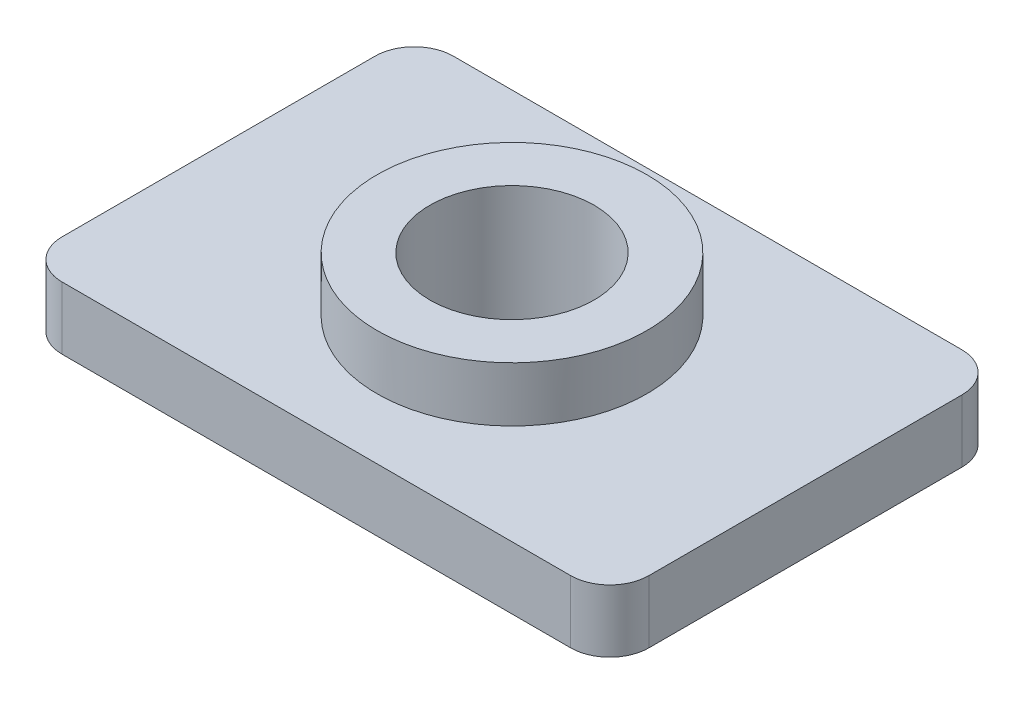
ISO-10303-21;
HEADER;
FILE_DESCRIPTION(('STEP AP214'),'2;1');
FILE_NAME('part.step','',(''),(''),'','','');
FILE_SCHEMA(('AUTOMOTIVE_DESIGN { 1 0 10303 214 1 1 1 1 }'));
ENDSEC;
DATA;
#1=APPLICATION_CONTEXT('core data for automotive mechanical design processes');
#2=APPLICATION_PROTOCOL_DEFINITION('international standard','automotive_design',2000,#1);
#3=PRODUCT_CONTEXT('',#1,'mechanical');
#4=PRODUCT('Part','Part','',(#3));
#5=PRODUCT_RELATED_PRODUCT_CATEGORY('part','',(#4));
#6=PRODUCT_DEFINITION_FORMATION('','',#4);
#7=PRODUCT_DEFINITION_CONTEXT('part definition',#1,'design');
#8=PRODUCT_DEFINITION('design','',#6,#7);
#9=PRODUCT_DEFINITION_SHAPE('','',#8);
#10=(LENGTH_UNIT() NAMED_UNIT(*) SI_UNIT(.MILLI.,.METRE.));
#11=(NAMED_UNIT(*) PLANE_ANGLE_UNIT() SI_UNIT($,.RADIAN.));
#12=(NAMED_UNIT(*) SI_UNIT($,.STERADIAN.) SOLID_ANGLE_UNIT());
#13=UNCERTAINTY_MEASURE_WITH_UNIT(LENGTH_MEASURE(1.E-05),#10,'distance_accuracy_value','');
#14=(GEOMETRIC_REPRESENTATION_CONTEXT(3) GLOBAL_UNCERTAINTY_ASSIGNED_CONTEXT((#13)) GLOBAL_UNIT_ASSIGNED_CONTEXT((#10,
#11,#12)) REPRESENTATION_CONTEXT('',''));
#15=CARTESIAN_POINT('',(0.,0.,0.));
#16=DIRECTION('',(0.,0.,1.));
#17=DIRECTION('',(1.,0.,0.));
#18=AXIS2_PLACEMENT_3D('',#15,#16,#17);
#19=CARTESIAN_POINT('',(14.,1.6,-9.));
#20=DIRECTION('',(0.,-1.,0.));
#21=DIRECTION('',(0.,0.,-1.));
#22=AXIS2_PLACEMENT_3D('',#19,#20,#21);
#23=PLANE('',#22);
#24=CARTESIAN_POINT('',(14.,1.6,-9.));
#25=DIRECTION('',(0.,1.,0.));
#26=DIRECTION('',(0.,0.,-1.));
#27=AXIS2_PLACEMENT_3D('',#24,#25,#26);
#28=CIRCLE('',#27,1.);
#29=CARTESIAN_POINT('',(15.,1.6,-8.99999999999999));
#30=VERTEX_POINT('',#29);
#31=CARTESIAN_POINT('',(14.,1.6,-10.));
#32=VERTEX_POINT('',#31);
#33=EDGE_CURVE('E145',#30,#32,#28,.T.);
#34=ORIENTED_EDGE('',*,*,#33,.T.);
#35=DIRECTION('',(-1.,0.,0.));
#36=VECTOR('',#35,1.);
#37=CARTESIAN_POINT('',(1.00000000000001,1.6,-10.));
#38=LINE('',#37,#36);
#39=CARTESIAN_POINT('',(1.00000000000001,1.6,-10.));
#40=VERTEX_POINT('',#39);
#41=EDGE_CURVE('E93',#32,#40,#38,.T.);
#42=ORIENTED_EDGE('',*,*,#41,.T.);
#43=CARTESIAN_POINT('',(1.,1.6,-9.));
#44=DIRECTION('',(0.,1.,0.));
#45=DIRECTION('',(0.,0.,-1.));
#46=AXIS2_PLACEMENT_3D('',#43,#44,#45);
#47=CIRCLE('',#46,1.);
#48=CARTESIAN_POINT('',(0.,1.6,-8.99999999999999));
#49=VERTEX_POINT('',#48);
#50=EDGE_CURVE('E176',#40,#49,#47,.T.);
#51=ORIENTED_EDGE('',*,*,#50,.T.);
#52=DIRECTION('',(0.,0.,1.));
#53=VECTOR('',#52,1.);
#54=CARTESIAN_POINT('',(0.,1.6,-1.00000000000001));
#55=LINE('',#54,#53);
#56=CARTESIAN_POINT('',(0.,1.6,-1.00000000000001));
#57=VERTEX_POINT('',#56);
#58=EDGE_CURVE('E175',#49,#57,#55,.T.);
#59=ORIENTED_EDGE('',*,*,#58,.T.);
#60=CARTESIAN_POINT('',(1.,1.6,-1.));
#61=DIRECTION('',(0.,1.,0.));
#62=DIRECTION('',(0.,0.,-1.));
#63=AXIS2_PLACEMENT_3D('',#60,#61,#62);
#64=CIRCLE('',#63,1.);
#65=CARTESIAN_POINT('',(1.00000000000001,1.6,0.));
#66=VERTEX_POINT('',#65);
#67=EDGE_CURVE('E112',#57,#66,#64,.T.);
#68=ORIENTED_EDGE('',*,*,#67,.T.);
#69=DIRECTION('',(1.,0.,0.));
#70=VECTOR('',#69,1.);
#71=CARTESIAN_POINT('',(1.00000000000001,1.6,0.));
#72=LINE('',#71,#70);
#73=CARTESIAN_POINT('',(14.,1.6,0.));
#74=VERTEX_POINT('',#73);
#75=EDGE_CURVE('E106',#66,#74,#72,.T.);
#76=ORIENTED_EDGE('',*,*,#75,.T.);
#77=CARTESIAN_POINT('',(14.,1.6,-1.));
#78=DIRECTION('',(0.,1.,0.));
#79=DIRECTION('',(0.,0.,1.));
#80=AXIS2_PLACEMENT_3D('',#77,#78,#79);
#81=CIRCLE('',#80,1.);
#82=CARTESIAN_POINT('',(15.,1.6,-1.00000000000001));
#83=VERTEX_POINT('',#82);
#84=EDGE_CURVE('E110',#74,#83,#81,.T.);
#85=ORIENTED_EDGE('',*,*,#84,.T.);
#86=DIRECTION('',(0.,0.,-1.));
#87=VECTOR('',#86,1.);
#88=CARTESIAN_POINT('',(15.,1.6,-1.00000000000001));
#89=LINE('',#88,#87);
#90=EDGE_CURVE('E49',#83,#30,#89,.T.);
#91=ORIENTED_EDGE('',*,*,#90,.T.);
#92=EDGE_LOOP('',(#34,#42,#51,#59,#68,#76,#85,#91));
#93=FACE_BOUND('',#92,.T.);
#94=CARTESIAN_POINT('',(7.5,1.6,-5.));
#95=DIRECTION('',(0.,-1.,0.));
#96=DIRECTION('',(0.,0.,-1.));
#97=AXIS2_PLACEMENT_3D('',#94,#95,#96);
#98=CIRCLE('',#97,3.45);
#99=CARTESIAN_POINT('',(7.5,1.6,-8.45));
#100=VERTEX_POINT('',#99);
#101=EDGE_CURVE('E11',#100,#100,#98,.F.);
#102=ORIENTED_EDGE('',*,*,#101,.F.);
#103=EDGE_LOOP('',(#102));
#104=FACE_BOUND('',#103,.T.);
#105=ADVANCED_FACE('F32',(#93,#104),#23,.F.);
#106=CARTESIAN_POINT('',(14.,1.6,-9.));
#107=DIRECTION('',(0.,-1.,0.));
#108=DIRECTION('',(0.,0.,-1.));
#109=AXIS2_PLACEMENT_3D('',#106,#107,#108);
#110=CYLINDRICAL_SURFACE('',#109,1.);
#111=CARTESIAN_POINT('',(14.,0.,-9.));
#112=DIRECTION('',(0.,1.,0.));
#113=DIRECTION('',(0.,0.,-1.));
#114=AXIS2_PLACEMENT_3D('',#111,#112,#113);
#115=CIRCLE('',#114,1.);
#116=CARTESIAN_POINT('',(15.,0.,-8.99999999999999));
#117=VERTEX_POINT('',#116);
#118=CARTESIAN_POINT('',(14.,0.,-10.));
#119=VERTEX_POINT('',#118);
#120=EDGE_CURVE('E130',#117,#119,#115,.T.);
#121=ORIENTED_EDGE('',*,*,#120,.T.);
#122=DIRECTION('',(0.,-1.,0.));
#123=VECTOR('',#122,1.);
#124=CARTESIAN_POINT('',(14.,1.6,-10.));
#125=LINE('',#124,#123);
#126=EDGE_CURVE('E41',#32,#119,#125,.T.);
#127=ORIENTED_EDGE('',*,*,#126,.F.);
#128=ORIENTED_EDGE('',*,*,#33,.F.);
#129=DIRECTION('',(0.,-1.,0.));
#130=VECTOR('',#129,1.);
#131=CARTESIAN_POINT('',(15.,1.6,-8.99999999999999));
#132=LINE('',#131,#130);
#133=EDGE_CURVE('E126',#30,#117,#132,.T.);
#134=ORIENTED_EDGE('',*,*,#133,.T.);
#135=EDGE_LOOP('',(#121,#127,#128,#134));
#136=FACE_BOUND('',#135,.T.);
#137=ADVANCED_FACE('F34',(#136),#110,.T.);
#138=CARTESIAN_POINT('',(1.00000000000001,1.6,-10.));
#139=DIRECTION('',(0.,0.,1.));
#140=DIRECTION('',(1.,0.,0.));
#141=AXIS2_PLACEMENT_3D('',#138,#139,#140);
#142=PLANE('',#141);
#143=DIRECTION('',(-1.,0.,0.));
#144=VECTOR('',#143,1.);
#145=CARTESIAN_POINT('',(1.00000000000001,0.,-10.));
#146=LINE('',#145,#144);
#147=CARTESIAN_POINT('',(1.00000000000001,0.,-10.));
#148=VERTEX_POINT('',#147);
#149=EDGE_CURVE('E133',#119,#148,#146,.T.);
#150=ORIENTED_EDGE('',*,*,#149,.T.);
#151=DIRECTION('',(0.,-1.,0.));
#152=VECTOR('',#151,1.);
#153=CARTESIAN_POINT('',(1.00000000000001,1.6,-10.));
#154=LINE('',#153,#152);
#155=EDGE_CURVE('E155',#40,#148,#154,.T.);
#156=ORIENTED_EDGE('',*,*,#155,.F.);
#157=ORIENTED_EDGE('',*,*,#41,.F.);
#158=ORIENTED_EDGE('',*,*,#126,.T.);
#159=EDGE_LOOP('',(#150,#156,#157,#158));
#160=FACE_BOUND('',#159,.T.);
#161=ADVANCED_FACE('F158',(#160),#142,.F.);
#162=CARTESIAN_POINT('',(1.,1.6,-9.));
#163=DIRECTION('',(0.,-1.,0.));
#164=DIRECTION('',(0.,0.,-1.));
#165=AXIS2_PLACEMENT_3D('',#162,#163,#164);
#166=CYLINDRICAL_SURFACE('',#165,1.);
#167=CARTESIAN_POINT('',(1.,0.,-9.));
#168=DIRECTION('',(0.,1.,0.));
#169=DIRECTION('',(0.,0.,-1.));
#170=AXIS2_PLACEMENT_3D('',#167,#168,#169);
#171=CIRCLE('',#170,1.);
#172=CARTESIAN_POINT('',(0.,0.,-8.99999999999999));
#173=VERTEX_POINT('',#172);
#174=EDGE_CURVE('E136',#148,#173,#171,.T.);
#175=ORIENTED_EDGE('',*,*,#174,.T.);
#176=DIRECTION('',(0.,-1.,0.));
#177=VECTOR('',#176,1.);
#178=CARTESIAN_POINT('',(0.,1.6,-8.99999999999999));
#179=LINE('',#178,#177);
#180=EDGE_CURVE('E152',#49,#173,#179,.T.);
#181=ORIENTED_EDGE('',*,*,#180,.F.);
#182=ORIENTED_EDGE('',*,*,#50,.F.);
#183=ORIENTED_EDGE('',*,*,#155,.T.);
#184=EDGE_LOOP('',(#175,#181,#182,#183));
#185=FACE_BOUND('',#184,.T.);
#186=ADVANCED_FACE('F169',(#185),#166,.T.);
#187=CARTESIAN_POINT('',(0.,1.6,-1.00000000000001));
#188=DIRECTION('',(1.,0.,0.));
#189=DIRECTION('',(0.,0.,-1.));
#190=AXIS2_PLACEMENT_3D('',#187,#188,#189);
#191=PLANE('',#190);
#192=DIRECTION('',(0.,0.,1.));
#193=VECTOR('',#192,1.);
#194=CARTESIAN_POINT('',(0.,0.,-1.00000000000001));
#195=LINE('',#194,#193);
#196=CARTESIAN_POINT('',(0.,0.,-1.00000000000001));
#197=VERTEX_POINT('',#196);
#198=EDGE_CURVE('E138',#173,#197,#195,.T.);
#199=ORIENTED_EDGE('',*,*,#198,.T.);
#200=DIRECTION('',(0.,-1.,0.));
#201=VECTOR('',#200,1.);
#202=CARTESIAN_POINT('',(0.,1.6,-1.00000000000001));
#203=LINE('',#202,#201);
#204=EDGE_CURVE('E149',#57,#197,#203,.T.);
#205=ORIENTED_EDGE('',*,*,#204,.F.);
#206=ORIENTED_EDGE('',*,*,#58,.F.);
#207=ORIENTED_EDGE('',*,*,#180,.T.);
#208=EDGE_LOOP('',(#199,#205,#206,#207));
#209=FACE_BOUND('',#208,.T.);
#210=ADVANCED_FACE('F173',(#209),#191,.F.);
#211=CARTESIAN_POINT('',(1.,1.6,-1.));
#212=DIRECTION('',(0.,-1.,0.));
#213=DIRECTION('',(0.,0.,-1.));
#214=AXIS2_PLACEMENT_3D('',#211,#212,#213);
#215=CYLINDRICAL_SURFACE('',#214,1.);
#216=CARTESIAN_POINT('',(1.,0.,-1.));
#217=DIRECTION('',(0.,1.,0.));
#218=DIRECTION('',(0.,0.,-1.));
#219=AXIS2_PLACEMENT_3D('',#216,#217,#218);
#220=CIRCLE('',#219,1.);
#221=CARTESIAN_POINT('',(1.00000000000001,0.,0.));
#222=VERTEX_POINT('',#221);
#223=EDGE_CURVE('E140',#197,#222,#220,.T.);
#224=ORIENTED_EDGE('',*,*,#223,.T.);
#225=DIRECTION('',(0.,-1.,0.));
#226=VECTOR('',#225,1.);
#227=CARTESIAN_POINT('',(1.00000000000001,1.6,0.));
#228=LINE('',#227,#226);
#229=EDGE_CURVE('E121',#66,#222,#228,.T.);
#230=ORIENTED_EDGE('',*,*,#229,.F.);
#231=ORIENTED_EDGE('',*,*,#67,.F.);
#232=ORIENTED_EDGE('',*,*,#204,.T.);
#233=EDGE_LOOP('',(#224,#230,#231,#232));
#234=FACE_BOUND('',#233,.T.);
#235=ADVANCED_FACE('F220',(#234),#215,.T.);
#236=CARTESIAN_POINT('',(1.00000000000001,1.6,0.));
#237=DIRECTION('',(0.,0.,-1.));
#238=DIRECTION('',(-1.,0.,0.));
#239=AXIS2_PLACEMENT_3D('',#236,#237,#238);
#240=PLANE('',#239);
#241=DIRECTION('',(1.,0.,0.));
#242=VECTOR('',#241,1.);
#243=CARTESIAN_POINT('',(1.00000000000001,0.,0.));
#244=LINE('',#243,#242);
#245=CARTESIAN_POINT('',(14.,0.,0.));
#246=VERTEX_POINT('',#245);
#247=EDGE_CURVE('E120',#222,#246,#244,.T.);
#248=ORIENTED_EDGE('',*,*,#247,.T.);
#249=DIRECTION('',(0.,-1.,0.));
#250=VECTOR('',#249,1.);
#251=CARTESIAN_POINT('',(14.,1.6,0.));
#252=LINE('',#251,#250);
#253=EDGE_CURVE('E117',#74,#246,#252,.T.);
#254=ORIENTED_EDGE('',*,*,#253,.F.);
#255=ORIENTED_EDGE('',*,*,#75,.F.);
#256=ORIENTED_EDGE('',*,*,#229,.T.);
#257=EDGE_LOOP('',(#248,#254,#255,#256));
#258=FACE_BOUND('',#257,.T.);
#259=ADVANCED_FACE('F118',(#258),#240,.F.);
#260=CARTESIAN_POINT('',(14.,1.6,-1.));
#261=DIRECTION('',(0.,-1.,0.));
#262=DIRECTION('',(0.,0.,-1.));
#263=AXIS2_PLACEMENT_3D('',#260,#261,#262);
#264=CYLINDRICAL_SURFACE('',#263,1.);
#265=CARTESIAN_POINT('',(14.,0.,-1.));
#266=DIRECTION('',(0.,1.,0.));
#267=DIRECTION('',(0.,0.,1.));
#268=AXIS2_PLACEMENT_3D('',#265,#266,#267);
#269=CIRCLE('',#268,1.);
#270=CARTESIAN_POINT('',(15.,0.,-1.00000000000001));
#271=VERTEX_POINT('',#270);
#272=EDGE_CURVE('E78',#246,#271,#269,.T.);
#273=ORIENTED_EDGE('',*,*,#272,.T.);
#274=DIRECTION('',(0.,-1.,0.));
#275=VECTOR('',#274,1.);
#276=CARTESIAN_POINT('',(15.,1.6,-1.00000000000001));
#277=LINE('',#276,#275);
#278=EDGE_CURVE('E122',#83,#271,#277,.T.);
#279=ORIENTED_EDGE('',*,*,#278,.F.);
#280=ORIENTED_EDGE('',*,*,#84,.F.);
#281=ORIENTED_EDGE('',*,*,#253,.T.);
#282=EDGE_LOOP('',(#273,#279,#280,#281));
#283=FACE_BOUND('',#282,.T.);
#284=ADVANCED_FACE('F124',(#283),#264,.T.);
#285=CARTESIAN_POINT('',(15.,1.6,-1.00000000000001));
#286=DIRECTION('',(-1.,0.,0.));
#287=DIRECTION('',(0.,0.,1.));
#288=AXIS2_PLACEMENT_3D('',#285,#286,#287);
#289=PLANE('',#288);
#290=DIRECTION('',(0.,0.,-1.));
#291=VECTOR('',#290,1.);
#292=CARTESIAN_POINT('',(15.,0.,-1.00000000000001));
#293=LINE('',#292,#291);
#294=EDGE_CURVE('E84',#271,#117,#293,.T.);
#295=ORIENTED_EDGE('',*,*,#294,.T.);
#296=ORIENTED_EDGE('',*,*,#133,.F.);
#297=ORIENTED_EDGE('',*,*,#90,.F.);
#298=ORIENTED_EDGE('',*,*,#278,.T.);
#299=EDGE_LOOP('',(#295,#296,#297,#298));
#300=FACE_BOUND('',#299,.T.);
#301=ADVANCED_FACE('F212',(#300),#289,.F.);
#302=CARTESIAN_POINT('',(14.,0.,-9.));
#303=DIRECTION('',(0.,-1.,0.));
#304=DIRECTION('',(0.,0.,-1.));
#305=AXIS2_PLACEMENT_3D('',#302,#303,#304);
#306=PLANE('',#305);
#307=CARTESIAN_POINT('',(7.5,0.,-5.));
#308=DIRECTION('',(0.,-1.,0.));
#309=DIRECTION('',(0.,0.,-1.));
#310=AXIS2_PLACEMENT_3D('',#307,#308,#309);
#311=CIRCLE('',#310,2.1);
#312=CARTESIAN_POINT('',(7.5,0.,-2.9));
#313=VERTEX_POINT('',#312);
#314=EDGE_CURVE('E185',#313,#313,#311,.F.);
#315=ORIENTED_EDGE('',*,*,#314,.T.);
#316=EDGE_LOOP('',(#315));
#317=FACE_BOUND('',#316,.T.);
#318=ORIENTED_EDGE('',*,*,#120,.F.);
#319=ORIENTED_EDGE('',*,*,#294,.F.);
#320=ORIENTED_EDGE('',*,*,#272,.F.);
#321=ORIENTED_EDGE('',*,*,#247,.F.);
#322=ORIENTED_EDGE('',*,*,#223,.F.);
#323=ORIENTED_EDGE('',*,*,#198,.F.);
#324=ORIENTED_EDGE('',*,*,#174,.F.);
#325=ORIENTED_EDGE('',*,*,#149,.F.);
#326=EDGE_LOOP('',(#318,#319,#320,#321,#322,#323,#324,#325));
#327=FACE_BOUND('',#326,.T.);
#328=ADVANCED_FACE('F163',(#317,#327),#306,.T.);
#329=CARTESIAN_POINT('',(7.5,3.,-5.));
#330=DIRECTION('',(0.,-1.,0.));
#331=DIRECTION('',(0.,0.,-1.));
#332=AXIS2_PLACEMENT_3D('',#329,#330,#331);
#333=CYLINDRICAL_SURFACE('',#332,3.45);
#334=CARTESIAN_POINT('',(7.5,3.,-5.));
#335=DIRECTION('',(0.,1.,0.));
#336=DIRECTION('',(0.,0.,1.));
#337=AXIS2_PLACEMENT_3D('',#334,#335,#336);
#338=CIRCLE('',#337,3.45);
#339=CARTESIAN_POINT('',(7.5,3.,-1.55));
#340=VERTEX_POINT('',#339);
#341=EDGE_CURVE('E134',#340,#340,#338,.T.);
#342=ORIENTED_EDGE('',*,*,#341,.F.);
#343=EDGE_LOOP('',(#342));
#344=FACE_BOUND('',#343,.T.);
#345=ORIENTED_EDGE('',*,*,#101,.T.);
#346=EDGE_LOOP('',(#345));
#347=FACE_BOUND('',#346,.T.);
#348=ADVANCED_FACE('F196',(#344,#347),#333,.T.);
#349=CARTESIAN_POINT('',(7.5,3.,-5.));
#350=DIRECTION('',(0.,1.,0.));
#351=DIRECTION('',(0.,0.,1.));
#352=AXIS2_PLACEMENT_3D('',#349,#350,#351);
#353=PLANE('',#352);
#354=CARTESIAN_POINT('',(7.5,3.,-5.));
#355=DIRECTION('',(0.,1.,0.));
#356=DIRECTION('',(0.,0.,1.));
#357=AXIS2_PLACEMENT_3D('',#354,#355,#356);
#358=CIRCLE('',#357,2.1);
#359=CARTESIAN_POINT('',(7.5,3.,-2.9));
#360=VERTEX_POINT('',#359);
#361=EDGE_CURVE('E184',#360,#360,#358,.T.);
#362=ORIENTED_EDGE('',*,*,#361,.F.);
#363=EDGE_LOOP('',(#362));
#364=FACE_BOUND('',#363,.T.);
#365=ORIENTED_EDGE('',*,*,#341,.T.);
#366=EDGE_LOOP('',(#365));
#367=FACE_BOUND('',#366,.T.);
#368=ADVANCED_FACE('F193',(#364,#367),#353,.T.);
#369=CARTESIAN_POINT('',(7.5,-0.00100000000000013,-5.));
#370=DIRECTION('',(0.,1.,0.));
#371=DIRECTION('',(0.,0.,1.));
#372=AXIS2_PLACEMENT_3D('',#369,#370,#371);
#373=CYLINDRICAL_SURFACE('',#372,2.1);
#374=CARTESIAN_POINT('',(7.5,0.,-2.9));
#375=CARTESIAN_POINT('',(7.5,0.03125,-2.9));
#376=CARTESIAN_POINT('',(7.5,0.0625,-2.9));
#377=CARTESIAN_POINT('',(7.5,0.125,-2.9));
#378=CARTESIAN_POINT('',(7.5,0.15625,-2.9));
#379=CARTESIAN_POINT('',(7.5,0.21875,-2.9));
#380=CARTESIAN_POINT('',(7.5,0.25,-2.9));
#381=CARTESIAN_POINT('',(7.5,0.3125,-2.9));
#382=CARTESIAN_POINT('',(7.5,0.34375,-2.9));
#383=CARTESIAN_POINT('',(7.5,0.40625,-2.9));
#384=CARTESIAN_POINT('',(7.5,0.4375,-2.9));
#385=CARTESIAN_POINT('',(7.5,0.5,-2.9));
#386=CARTESIAN_POINT('',(7.5,0.53125,-2.9));
#387=CARTESIAN_POINT('',(7.5,0.59375,-2.9));
#388=CARTESIAN_POINT('',(7.5,0.625,-2.9));
#389=CARTESIAN_POINT('',(7.5,0.6875,-2.9));
#390=CARTESIAN_POINT('',(7.5,0.71875,-2.9));
#391=CARTESIAN_POINT('',(7.5,0.78125,-2.9));
#392=CARTESIAN_POINT('',(7.5,0.8125,-2.9));
#393=CARTESIAN_POINT('',(7.5,0.875,-2.9));
#394=CARTESIAN_POINT('',(7.5,0.90625,-2.9));
#395=CARTESIAN_POINT('',(7.5,0.96875,-2.9));
#396=CARTESIAN_POINT('',(7.5,1.,-2.9));
#397=CARTESIAN_POINT('',(7.5,1.0625,-2.9));
#398=CARTESIAN_POINT('',(7.5,1.09375,-2.9));
#399=CARTESIAN_POINT('',(7.5,1.15625,-2.9));
#400=CARTESIAN_POINT('',(7.5,1.1875,-2.9));
#401=CARTESIAN_POINT('',(7.5,1.25,-2.9));
#402=CARTESIAN_POINT('',(7.5,1.28125,-2.9));
#403=CARTESIAN_POINT('',(7.5,1.34375,-2.9));
#404=CARTESIAN_POINT('',(7.5,1.375,-2.9));
#405=CARTESIAN_POINT('',(7.5,1.4375,-2.9));
#406=CARTESIAN_POINT('',(7.5,1.46875,-2.9));
#407=CARTESIAN_POINT('',(7.5,1.53125,-2.9));
#408=CARTESIAN_POINT('',(7.5,1.5625,-2.9));
#409=CARTESIAN_POINT('',(7.5,1.625,-2.9));
#410=CARTESIAN_POINT('',(7.5,1.65625,-2.9));
#411=CARTESIAN_POINT('',(7.5,1.71875,-2.9));
#412=CARTESIAN_POINT('',(7.5,1.75,-2.9));
#413=CARTESIAN_POINT('',(7.5,1.8125,-2.9));
#414=CARTESIAN_POINT('',(7.5,1.84375,-2.9));
#415=CARTESIAN_POINT('',(7.5,1.90625,-2.9));
#416=CARTESIAN_POINT('',(7.5,1.9375,-2.9));
#417=CARTESIAN_POINT('',(7.5,2.,-2.9));
#418=CARTESIAN_POINT('',(7.5,2.03125,-2.9));
#419=CARTESIAN_POINT('',(7.5,2.09375,-2.9));
#420=CARTESIAN_POINT('',(7.5,2.125,-2.9));
#421=CARTESIAN_POINT('',(7.5,2.1875,-2.9));
#422=CARTESIAN_POINT('',(7.5,2.21875,-2.9));
#423=CARTESIAN_POINT('',(7.5,2.28125,-2.9));
#424=CARTESIAN_POINT('',(7.5,2.3125,-2.9));
#425=CARTESIAN_POINT('',(7.5,2.375,-2.9));
#426=CARTESIAN_POINT('',(7.5,2.40625,-2.9));
#427=CARTESIAN_POINT('',(7.5,2.46875,-2.9));
#428=CARTESIAN_POINT('',(7.5,2.5,-2.9));
#429=CARTESIAN_POINT('',(7.5,2.5625,-2.9));
#430=CARTESIAN_POINT('',(7.5,2.59375,-2.9));
#431=CARTESIAN_POINT('',(7.5,2.65625,-2.9));
#432=CARTESIAN_POINT('',(7.5,2.6875,-2.9));
#433=CARTESIAN_POINT('',(7.5,2.75,-2.9));
#434=CARTESIAN_POINT('',(7.5,2.78125,-2.9));
#435=CARTESIAN_POINT('',(7.5,2.84375,-2.9));
#436=CARTESIAN_POINT('',(7.5,2.875,-2.9));
#437=CARTESIAN_POINT('',(7.5,2.9375,-2.9));
#438=CARTESIAN_POINT('',(7.5,2.96875,-2.9));
#439=CARTESIAN_POINT('',(7.5,3.,-2.9));
#440=B_SPLINE_CURVE_WITH_KNOTS('',3,(#374,#375,#376,#377,#378,#379,#380,#381,#382,#383,#384,
#385,#386,#387,#388,#389,#390,#391,#392,#393,#394,#395,#396,#397,#398,#399,#400,#401,#402,#403,
#404,#405,#406,#407,#408,#409,#410,#411,#412,#413,#414,#415,#416,#417,#418,#419,#420,#421,#422,
#423,#424,#425,#426,#427,#428,#429,#430,#431,#432,#433,#434,#435,#436,#437,#438,#439),
.UNSPECIFIED.,.F.,.F.,(4,2,2,2,2,2,2,2,2,2,2,2,2,2,2,2,2,2,2,2,2,2,2,2,2,2,2,2,2,2,2,2,4),(0.,
0.09375,0.1875,0.28125,0.375,0.46875,0.5625,0.65625,0.75,0.84375,0.9375,1.03125,1.125,1.21875,
1.3125,1.40625,1.5,1.59375,1.6875,1.78125,1.875,1.96875,2.0625,2.15625,2.25,2.34375,2.4375,
2.53125,2.625,2.71875,2.8125,2.90625,3.),.UNSPECIFIED.);
#441=EDGE_CURVE('BSEAM191',#313,#360,#440,.T.);
#442=ORIENTED_EDGE('',*,*,#314,.F.);
#443=ORIENTED_EDGE('',*,*,#361,.T.);
#444=ORIENTED_EDGE('',*,*,#441,.T.);
#445=ORIENTED_EDGE('',*,*,#441,.F.);
#446=EDGE_LOOP('',(#442,#444,#443,#445));
#447=FACE_BOUND('',#446,.T.);
#448=ADVANCED_FACE('F191',(#447),#373,.F.);
#449=CLOSED_SHELL('',(#105,#137,#161,#186,#210,#235,#259,#284,#301,#328,#348,#368,#448));
#450=MANIFOLD_SOLID_BREP('B2',#449);
#451=ADVANCED_BREP_SHAPE_REPRESENTATION('',(#18,#450),#14);
#452=SHAPE_DEFINITION_REPRESENTATION(#9,#451);
ENDSEC;
END-ISO-10303-21;
